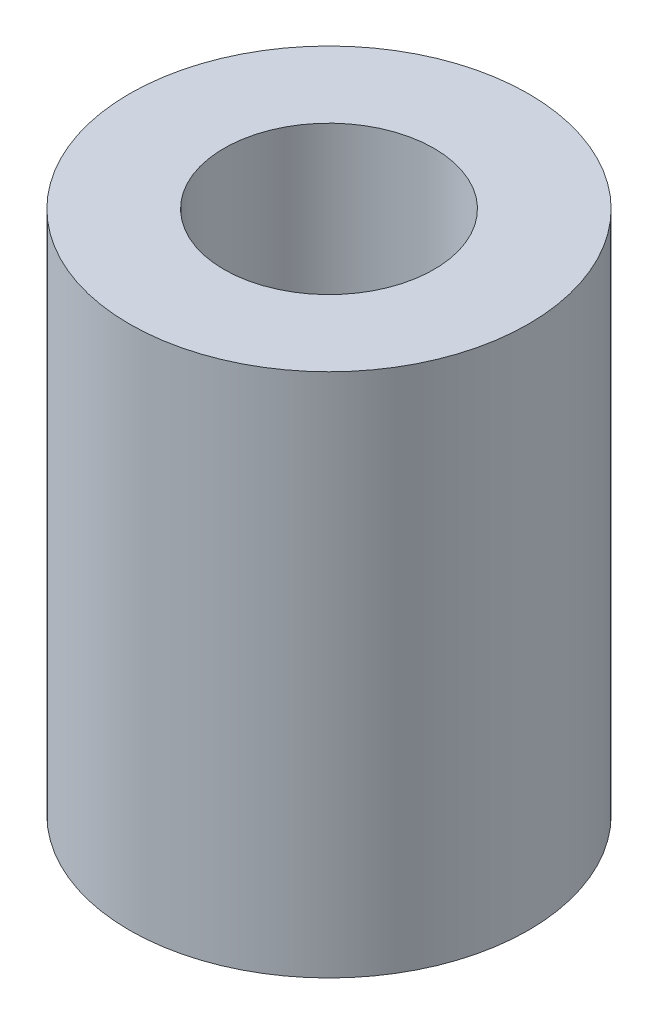
ISO-10303-21;
HEADER;
FILE_DESCRIPTION(('STEP AP214'),'2;1');
FILE_NAME('part.step','',(''),(''),'','','');
FILE_SCHEMA(('AUTOMOTIVE_DESIGN { 1 0 10303 214 1 1 1 1 }'));
ENDSEC;
DATA;
#1=APPLICATION_CONTEXT('core data for automotive mechanical design processes');
#2=APPLICATION_PROTOCOL_DEFINITION('international standard','automotive_design',2000,#1);
#3=PRODUCT_CONTEXT('',#1,'mechanical');
#4=PRODUCT('Part','Part','',(#3));
#5=PRODUCT_RELATED_PRODUCT_CATEGORY('part','',(#4));
#6=PRODUCT_DEFINITION_FORMATION('','',#4);
#7=PRODUCT_DEFINITION_CONTEXT('part definition',#1,'design');
#8=PRODUCT_DEFINITION('design','',#6,#7);
#9=PRODUCT_DEFINITION_SHAPE('','',#8);
#10=(LENGTH_UNIT() NAMED_UNIT(*) SI_UNIT(.MILLI.,.METRE.));
#11=(NAMED_UNIT(*) PLANE_ANGLE_UNIT() SI_UNIT($,.RADIAN.));
#12=(NAMED_UNIT(*) SI_UNIT($,.STERADIAN.) SOLID_ANGLE_UNIT());
#13=UNCERTAINTY_MEASURE_WITH_UNIT(LENGTH_MEASURE(1.E-05),#10,'distance_accuracy_value','');
#14=(GEOMETRIC_REPRESENTATION_CONTEXT(3) GLOBAL_UNCERTAINTY_ASSIGNED_CONTEXT((#13)) GLOBAL_UNIT_ASSIGNED_CONTEXT((#10,
#11,#12)) REPRESENTATION_CONTEXT('',''));
#15=CARTESIAN_POINT('',(0.,0.,0.));
#16=DIRECTION('',(0.,0.,1.));
#17=DIRECTION('',(1.,0.,0.));
#18=AXIS2_PLACEMENT_3D('',#15,#16,#17);
#19=CARTESIAN_POINT('',(0.,25.,0.));
#20=DIRECTION('',(0.,-1.,0.));
#21=DIRECTION('',(0.,0.,-1.));
#22=AXIS2_PLACEMENT_3D('',#19,#20,#21);
#23=CYLINDRICAL_SURFACE('',#22,9.5);
#24=CARTESIAN_POINT('',(0.,25.,0.));
#25=DIRECTION('',(0.,1.,0.));
#26=DIRECTION('',(0.,0.,1.));
#27=AXIS2_PLACEMENT_3D('',#24,#25,#26);
#28=CIRCLE('',#27,9.5);
#29=CARTESIAN_POINT('',(0.,25.,9.5));
#30=VERTEX_POINT('',#29);
#31=EDGE_CURVE('E11',#30,#30,#28,.T.);
#32=ORIENTED_EDGE('',*,*,#31,.F.);
#33=EDGE_LOOP('',(#32));
#34=FACE_BOUND('',#33,.T.);
#35=CARTESIAN_POINT('',(0.,0.,0.));
#36=DIRECTION('',(0.,1.,0.));
#37=DIRECTION('',(0.,0.,1.));
#38=AXIS2_PLACEMENT_3D('',#35,#36,#37);
#39=CIRCLE('',#38,9.5);
#40=CARTESIAN_POINT('',(0.,0.,9.5));
#41=VERTEX_POINT('',#40);
#42=EDGE_CURVE('E46',#41,#41,#39,.T.);
#43=ORIENTED_EDGE('',*,*,#42,.T.);
#44=EDGE_LOOP('',(#43));
#45=FACE_BOUND('',#44,.T.);
#46=ADVANCED_FACE('F38',(#34,#45),#23,.T.);
#47=CARTESIAN_POINT('',(0.,25.,0.));
#48=DIRECTION('',(0.,1.,0.));
#49=DIRECTION('',(0.,0.,1.));
#50=AXIS2_PLACEMENT_3D('',#47,#48,#49);
#51=PLANE('',#50);
#52=CARTESIAN_POINT('',(0.,25.,0.));
#53=DIRECTION('',(0.,1.,0.));
#54=DIRECTION('',(0.,0.,1.));
#55=AXIS2_PLACEMENT_3D('',#52,#53,#54);
#56=CIRCLE('',#55,5.);
#57=CARTESIAN_POINT('',(0.,25.,5.));
#58=VERTEX_POINT('',#57);
#59=EDGE_CURVE('E57',#58,#58,#56,.T.);
#60=ORIENTED_EDGE('',*,*,#59,.F.);
#61=EDGE_LOOP('',(#60));
#62=FACE_BOUND('',#61,.T.);
#63=ORIENTED_EDGE('',*,*,#31,.T.);
#64=EDGE_LOOP('',(#63));
#65=FACE_BOUND('',#64,.T.);
#66=ADVANCED_FACE('F85',(#62,#65),#51,.T.);
#67=CARTESIAN_POINT('',(0.,0.,0.));
#68=DIRECTION('',(0.,1.,0.));
#69=DIRECTION('',(0.,0.,1.));
#70=AXIS2_PLACEMENT_3D('',#67,#68,#69);
#71=PLANE('',#70);
#72=CARTESIAN_POINT('',(0.,0.,0.));
#73=DIRECTION('',(0.,-1.,0.));
#74=DIRECTION('',(0.,0.,-1.));
#75=AXIS2_PLACEMENT_3D('',#72,#73,#74);
#76=CIRCLE('',#75,2.);
#77=CARTESIAN_POINT('',(0.,0.,-2.));
#78=VERTEX_POINT('',#77);
#79=EDGE_CURVE('E61',#78,#78,#76,.T.);
#80=ORIENTED_EDGE('',*,*,#79,.F.);
#81=EDGE_LOOP('',(#80));
#82=FACE_BOUND('',#81,.T.);
#83=ORIENTED_EDGE('',*,*,#42,.F.);
#84=EDGE_LOOP('',(#83));
#85=FACE_BOUND('',#84,.T.);
#86=ADVANCED_FACE('F81',(#82,#85),#71,.F.);
#87=CARTESIAN_POINT('',(0.,-14.1421356237309,0.));
#88=DIRECTION('',(0.,1.,0.));
#89=DIRECTION('',(0.,0.,1.));
#90=AXIS2_PLACEMENT_3D('',#87,#88,#89);
#91=CYLINDRICAL_SURFACE('',#90,5.);
#92=CARTESIAN_POINT('',(0.,5.,0.));
#93=DIRECTION('',(0.,1.,0.));
#94=DIRECTION('',(0.,0.,1.));
#95=AXIS2_PLACEMENT_3D('',#92,#93,#94);
#96=CIRCLE('',#95,5.);
#97=CARTESIAN_POINT('',(0.,5.,5.));
#98=VERTEX_POINT('',#97);
#99=EDGE_CURVE('E52',#98,#98,#96,.F.);
#100=CARTESIAN_POINT('',(0.,5.,5.));
#101=CARTESIAN_POINT('',(0.,5.20833333333333,5.));
#102=CARTESIAN_POINT('',(0.,5.41666666666667,5.));
#103=CARTESIAN_POINT('',(0.,5.83333333333334,5.));
#104=CARTESIAN_POINT('',(0.,6.04166666666667,5.));
#105=CARTESIAN_POINT('',(0.,6.45833333333333,5.));
#106=CARTESIAN_POINT('',(0.,6.66666666666667,5.));
#107=CARTESIAN_POINT('',(0.,7.08333333333333,5.));
#108=CARTESIAN_POINT('',(0.,7.29166666666667,5.));
#109=CARTESIAN_POINT('',(0.,7.70833333333333,5.));
#110=CARTESIAN_POINT('',(0.,7.91666666666667,5.));
#111=CARTESIAN_POINT('',(0.,8.33333333333333,5.));
#112=CARTESIAN_POINT('',(0.,8.54166666666667,5.));
#113=CARTESIAN_POINT('',(0.,8.95833333333333,5.));
#114=CARTESIAN_POINT('',(0.,9.16666666666667,5.));
#115=CARTESIAN_POINT('',(0.,9.58333333333333,5.));
#116=CARTESIAN_POINT('',(0.,9.79166666666667,5.));
#117=CARTESIAN_POINT('',(0.,10.2083333333333,5.));
#118=CARTESIAN_POINT('',(0.,10.4166666666667,5.));
#119=CARTESIAN_POINT('',(0.,10.8333333333333,5.));
#120=CARTESIAN_POINT('',(0.,11.0416666666667,5.));
#121=CARTESIAN_POINT('',(0.,11.4583333333333,5.));
#122=CARTESIAN_POINT('',(0.,11.6666666666667,5.));
#123=CARTESIAN_POINT('',(0.,12.0833333333333,5.));
#124=CARTESIAN_POINT('',(0.,12.2916666666667,5.));
#125=CARTESIAN_POINT('',(0.,12.7083333333333,5.));
#126=CARTESIAN_POINT('',(0.,12.9166666666667,5.));
#127=CARTESIAN_POINT('',(0.,13.3333333333333,5.));
#128=CARTESIAN_POINT('',(0.,13.5416666666667,5.));
#129=CARTESIAN_POINT('',(0.,13.9583333333333,5.));
#130=CARTESIAN_POINT('',(0.,14.1666666666667,5.));
#131=CARTESIAN_POINT('',(0.,14.5833333333333,5.));
#132=CARTESIAN_POINT('',(0.,14.7916666666667,5.));
#133=CARTESIAN_POINT('',(0.,15.2083333333333,5.));
#134=CARTESIAN_POINT('',(0.,15.4166666666667,5.));
#135=CARTESIAN_POINT('',(0.,15.8333333333333,5.));
#136=CARTESIAN_POINT('',(0.,16.0416666666667,5.));
#137=CARTESIAN_POINT('',(0.,16.4583333333333,5.));
#138=CARTESIAN_POINT('',(0.,16.6666666666667,5.));
#139=CARTESIAN_POINT('',(0.,17.0833333333333,5.));
#140=CARTESIAN_POINT('',(0.,17.2916666666667,5.));
#141=CARTESIAN_POINT('',(0.,17.7083333333333,5.));
#142=CARTESIAN_POINT('',(0.,17.9166666666667,5.));
#143=CARTESIAN_POINT('',(0.,18.3333333333333,5.));
#144=CARTESIAN_POINT('',(0.,18.5416666666667,5.));
#145=CARTESIAN_POINT('',(0.,18.9583333333333,5.));
#146=CARTESIAN_POINT('',(0.,19.1666666666667,5.));
#147=CARTESIAN_POINT('',(0.,19.5833333333333,5.));
#148=CARTESIAN_POINT('',(0.,19.7916666666667,5.));
#149=CARTESIAN_POINT('',(0.,20.2083333333333,5.));
#150=CARTESIAN_POINT('',(0.,20.4166666666667,5.));
#151=CARTESIAN_POINT('',(0.,20.8333333333333,5.));
#152=CARTESIAN_POINT('',(0.,21.0416666666667,5.));
#153=CARTESIAN_POINT('',(0.,21.4583333333333,5.));
#154=CARTESIAN_POINT('',(0.,21.6666666666667,5.));
#155=CARTESIAN_POINT('',(0.,22.0833333333333,5.));
#156=CARTESIAN_POINT('',(0.,22.2916666666667,5.));
#157=CARTESIAN_POINT('',(0.,22.7083333333333,5.));
#158=CARTESIAN_POINT('',(0.,22.9166666666667,5.));
#159=CARTESIAN_POINT('',(0.,23.3333333333333,5.));
#160=CARTESIAN_POINT('',(0.,23.5416666666667,5.));
#161=CARTESIAN_POINT('',(0.,23.9583333333333,5.));
#162=CARTESIAN_POINT('',(0.,24.1666666666667,5.));
#163=CARTESIAN_POINT('',(0.,24.5833333333333,5.));
#164=CARTESIAN_POINT('',(0.,24.7916666666667,5.));
#165=CARTESIAN_POINT('',(0.,25.,5.));
#166=B_SPLINE_CURVE_WITH_KNOTS('',3,(#100,#101,#102,#103,#104,#105,#106,#107,#108,#109,#110,
#111,#112,#113,#114,#115,#116,#117,#118,#119,#120,#121,#122,#123,#124,#125,#126,#127,#128,#129,
#130,#131,#132,#133,#134,#135,#136,#137,#138,#139,#140,#141,#142,#143,#144,#145,#146,#147,#148,
#149,#150,#151,#152,#153,#154,#155,#156,#157,#158,#159,#160,#161,#162,#163,#164,#165),
.UNSPECIFIED.,.F.,.F.,(4,2,2,2,2,2,2,2,2,2,2,2,2,2,2,2,2,2,2,2,2,2,2,2,2,2,2,2,2,2,2,2,4),(0.,
0.625000000000001,1.25,1.875,2.5,3.125,3.75,4.375,5.,5.625,6.25,6.875,7.5,8.125,8.75,9.375,10.,
10.625,11.25,11.875,12.5,13.125,13.75,14.375,15.,15.625,16.25,16.875,17.5,18.125,18.75,19.375,
20.),.UNSPECIFIED.);
#167=EDGE_CURVE('BSEAM75',#98,#58,#166,.T.);
#168=ORIENTED_EDGE('',*,*,#99,.T.);
#169=ORIENTED_EDGE('',*,*,#59,.T.);
#170=ORIENTED_EDGE('',*,*,#167,.T.);
#171=ORIENTED_EDGE('',*,*,#167,.F.);
#172=EDGE_LOOP('',(#168,#170,#169,#171));
#173=FACE_BOUND('',#172,.T.);
#174=ADVANCED_FACE('F75',(#173),#91,.F.);
#175=CARTESIAN_POINT('',(0.,5.,0.));
#176=DIRECTION('',(0.,1.,0.));
#177=DIRECTION('',(0.,0.,1.));
#178=AXIS2_PLACEMENT_3D('',#175,#176,#177);
#179=PLANE('',#178);
#180=CARTESIAN_POINT('',(0.,5.,0.));
#181=DIRECTION('',(0.,1.,0.));
#182=DIRECTION('',(0.,0.,1.));
#183=AXIS2_PLACEMENT_3D('',#180,#181,#182);
#184=CIRCLE('',#183,2.);
#185=CARTESIAN_POINT('',(0.,5.,2.));
#186=VERTEX_POINT('',#185);
#187=EDGE_CURVE('E41',#186,#186,#184,.T.);
#188=ORIENTED_EDGE('',*,*,#187,.F.);
#189=EDGE_LOOP('',(#188));
#190=FACE_BOUND('',#189,.T.);
#191=ORIENTED_EDGE('',*,*,#99,.F.);
#192=EDGE_LOOP('',(#191));
#193=FACE_BOUND('',#192,.T.);
#194=ADVANCED_FACE('F72',(#190,#193),#179,.T.);
#195=CARTESIAN_POINT('',(0.,25.,0.));
#196=DIRECTION('',(0.,-1.,0.));
#197=DIRECTION('',(0.,0.,-1.));
#198=AXIS2_PLACEMENT_3D('',#195,#196,#197);
#199=CYLINDRICAL_SURFACE('',#198,2.);
#200=ORIENTED_EDGE('',*,*,#187,.T.);
#201=EDGE_LOOP('',(#200));
#202=FACE_BOUND('',#201,.T.);
#203=ORIENTED_EDGE('',*,*,#79,.T.);
#204=EDGE_LOOP('',(#203));
#205=FACE_BOUND('',#204,.T.);
#206=ADVANCED_FACE('F70',(#202,#205),#199,.F.);
#207=CLOSED_SHELL('',(#46,#66,#86,#174,#194,#206));
#208=MANIFOLD_SOLID_BREP('B2',#207);
#209=ADVANCED_BREP_SHAPE_REPRESENTATION('',(#18,#208),#14);
#210=SHAPE_DEFINITION_REPRESENTATION(#9,#209);
ENDSEC;
END-ISO-10303-21;
